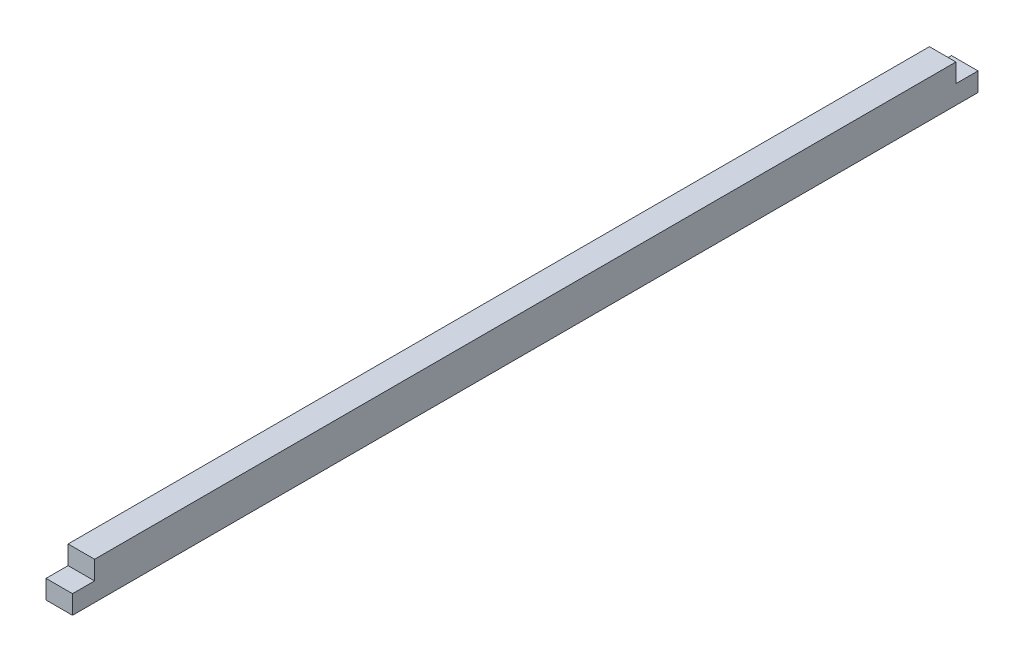
ISO-10303-21;
HEADER;
FILE_DESCRIPTION(('STEP AP214'),'2;1');
FILE_NAME('part.step','',(''),(''),'','','');
FILE_SCHEMA(('AUTOMOTIVE_DESIGN { 1 0 10303 214 1 1 1 1 }'));
ENDSEC;
DATA;
#1=APPLICATION_CONTEXT('core data for automotive mechanical design processes');
#2=APPLICATION_PROTOCOL_DEFINITION('international standard','automotive_design',2000,#1);
#3=PRODUCT_CONTEXT('',#1,'mechanical');
#4=PRODUCT('Part','Part','',(#3));
#5=PRODUCT_RELATED_PRODUCT_CATEGORY('part','',(#4));
#6=PRODUCT_DEFINITION_FORMATION('','',#4);
#7=PRODUCT_DEFINITION_CONTEXT('part definition',#1,'design');
#8=PRODUCT_DEFINITION('design','',#6,#7);
#9=PRODUCT_DEFINITION_SHAPE('','',#8);
#10=(LENGTH_UNIT() NAMED_UNIT(*) SI_UNIT(.MILLI.,.METRE.));
#11=(NAMED_UNIT(*) PLANE_ANGLE_UNIT() SI_UNIT($,.RADIAN.));
#12=(NAMED_UNIT(*) SI_UNIT($,.STERADIAN.) SOLID_ANGLE_UNIT());
#13=UNCERTAINTY_MEASURE_WITH_UNIT(LENGTH_MEASURE(1.E-05),#10,'distance_accuracy_value','');
#14=(GEOMETRIC_REPRESENTATION_CONTEXT(3) GLOBAL_UNCERTAINTY_ASSIGNED_CONTEXT((#13)) GLOBAL_UNIT_ASSIGNED_CONTEXT((#10,
#11,#12)) REPRESENTATION_CONTEXT('',''));
#15=CARTESIAN_POINT('',(0.,0.,0.));
#16=DIRECTION('',(0.,0.,1.));
#17=DIRECTION('',(1.,0.,0.));
#18=AXIS2_PLACEMENT_3D('',#15,#16,#17);
#19=CARTESIAN_POINT('',(12.,0.,0.));
#20=DIRECTION('',(0.,0.,-1.));
#21=DIRECTION('',(-1.,0.,0.));
#22=AXIS2_PLACEMENT_3D('',#19,#20,#21);
#23=PLANE('',#22);
#24=DIRECTION('',(0.,-1.,0.));
#25=VECTOR('',#24,1.);
#26=CARTESIAN_POINT('',(12.,0.,0.));
#27=LINE('',#26,#25);
#28=CARTESIAN_POINT('',(12.,8.5,0.));
#29=VERTEX_POINT('',#28);
#30=CARTESIAN_POINT('',(12.,0.,0.));
#31=VERTEX_POINT('',#30);
#32=EDGE_CURVE('E112',#29,#31,#27,.T.);
#33=ORIENTED_EDGE('',*,*,#32,.F.);
#34=DIRECTION('',(1.,0.,0.));
#35=VECTOR('',#34,1.);
#36=CARTESIAN_POINT('',(0.,8.5,0.));
#37=LINE('',#36,#35);
#38=CARTESIAN_POINT('',(0.,8.5,0.));
#39=VERTEX_POINT('',#38);
#40=EDGE_CURVE('E100',#39,#29,#37,.T.);
#41=ORIENTED_EDGE('',*,*,#40,.F.);
#42=DIRECTION('',(0.,-1.,0.));
#43=VECTOR('',#42,1.);
#44=CARTESIAN_POINT('',(0.,0.,0.));
#45=LINE('',#44,#43);
#46=CARTESIAN_POINT('',(0.,0.,0.));
#47=VERTEX_POINT('',#46);
#48=EDGE_CURVE('E110',#39,#47,#45,.T.);
#49=ORIENTED_EDGE('',*,*,#48,.T.);
#50=DIRECTION('',(-1.,0.,0.));
#51=VECTOR('',#50,1.);
#52=CARTESIAN_POINT('',(12.,0.,0.));
#53=LINE('',#52,#51);
#54=EDGE_CURVE('E11',#31,#47,#53,.T.);
#55=ORIENTED_EDGE('',*,*,#54,.F.);
#56=EDGE_LOOP('',(#33,#41,#49,#55));
#57=FACE_BOUND('',#56,.T.);
#58=ADVANCED_FACE('F33',(#57),#23,.F.);
#59=CARTESIAN_POINT('',(12.,0.,0.));
#60=DIRECTION('',(0.,1.,0.));
#61=DIRECTION('',(0.,0.,1.));
#62=AXIS2_PLACEMENT_3D('',#59,#60,#61);
#63=PLANE('',#62);
#64=DIRECTION('',(0.,0.,-1.));
#65=VECTOR('',#64,1.);
#66=CARTESIAN_POINT('',(0.,0.,0.));
#67=LINE('',#66,#65);
#68=CARTESIAN_POINT('',(0.,0.,-410.));
#69=VERTEX_POINT('',#68);
#70=EDGE_CURVE('E116',#47,#69,#67,.T.);
#71=ORIENTED_EDGE('',*,*,#70,.T.);
#72=DIRECTION('',(-1.,0.,0.));
#73=VECTOR('',#72,1.);
#74=CARTESIAN_POINT('',(12.,0.,-410.));
#75=LINE('',#74,#73);
#76=CARTESIAN_POINT('',(12.,0.,-410.));
#77=VERTEX_POINT('',#76);
#78=EDGE_CURVE('E40',#77,#69,#75,.T.);
#79=ORIENTED_EDGE('',*,*,#78,.F.);
#80=DIRECTION('',(0.,0.,-1.));
#81=VECTOR('',#80,1.);
#82=CARTESIAN_POINT('',(12.,0.,0.));
#83=LINE('',#82,#81);
#84=EDGE_CURVE('E142',#31,#77,#83,.T.);
#85=ORIENTED_EDGE('',*,*,#84,.F.);
#86=ORIENTED_EDGE('',*,*,#54,.T.);
#87=EDGE_LOOP('',(#71,#79,#85,#86));
#88=FACE_BOUND('',#87,.T.);
#89=ADVANCED_FACE('F177',(#88),#63,.F.);
#90=CARTESIAN_POINT('',(12.,0.,-410.));
#91=DIRECTION('',(0.,0.,1.));
#92=DIRECTION('',(1.,0.,0.));
#93=AXIS2_PLACEMENT_3D('',#90,#91,#92);
#94=PLANE('',#93);
#95=DIRECTION('',(0.,1.,0.));
#96=VECTOR('',#95,1.);
#97=CARTESIAN_POINT('',(0.,0.,-410.));
#98=LINE('',#97,#96);
#99=CARTESIAN_POINT('',(0.,8.50000000000005,-410.));
#100=VERTEX_POINT('',#99);
#101=EDGE_CURVE('E119',#69,#100,#98,.T.);
#102=ORIENTED_EDGE('',*,*,#101,.T.);
#103=DIRECTION('',(1.,0.,0.));
#104=VECTOR('',#103,1.);
#105=CARTESIAN_POINT('',(0.,8.50000000000005,-410.));
#106=LINE('',#105,#104);
#107=CARTESIAN_POINT('',(12.,8.50000000000005,-410.));
#108=VERTEX_POINT('',#107);
#109=EDGE_CURVE('E151',#100,#108,#106,.T.);
#110=ORIENTED_EDGE('',*,*,#109,.T.);
#111=DIRECTION('',(0.,1.,0.));
#112=VECTOR('',#111,1.);
#113=CARTESIAN_POINT('',(12.,0.,-410.));
#114=LINE('',#113,#112);
#115=EDGE_CURVE('E136',#77,#108,#114,.T.);
#116=ORIENTED_EDGE('',*,*,#115,.F.);
#117=ORIENTED_EDGE('',*,*,#78,.T.);
#118=EDGE_LOOP('',(#102,#110,#116,#117));
#119=FACE_BOUND('',#118,.T.);
#120=ADVANCED_FACE('F175',(#119),#94,.F.);
#121=CARTESIAN_POINT('',(12.,17.,0.));
#122=DIRECTION('',(0.,-1.,0.));
#123=DIRECTION('',(0.,0.,-1.));
#124=AXIS2_PLACEMENT_3D('',#121,#122,#123);
#125=PLANE('',#124);
#126=DIRECTION('',(0.,0.,1.));
#127=VECTOR('',#126,1.);
#128=CARTESIAN_POINT('',(0.,17.,0.));
#129=LINE('',#128,#127);
#130=CARTESIAN_POINT('',(0.,17.,-400.));
#131=VERTEX_POINT('',#130);
#132=CARTESIAN_POINT('',(0.,17.,-10.));
#133=VERTEX_POINT('',#132);
#134=EDGE_CURVE('E129',#131,#133,#129,.T.);
#135=ORIENTED_EDGE('',*,*,#134,.T.);
#136=DIRECTION('',(1.,0.,0.));
#137=VECTOR('',#136,1.);
#138=CARTESIAN_POINT('',(0.,17.,-10.));
#139=LINE('',#138,#137);
#140=CARTESIAN_POINT('',(12.,17.,-10.));
#141=VERTEX_POINT('',#140);
#142=EDGE_CURVE('E117',#133,#141,#139,.T.);
#143=ORIENTED_EDGE('',*,*,#142,.T.);
#144=DIRECTION('',(0.,0.,1.));
#145=VECTOR('',#144,1.);
#146=CARTESIAN_POINT('',(12.,17.,0.));
#147=LINE('',#146,#145);
#148=CARTESIAN_POINT('',(12.,17.,-400.));
#149=VERTEX_POINT('',#148);
#150=EDGE_CURVE('E124',#149,#141,#147,.T.);
#151=ORIENTED_EDGE('',*,*,#150,.F.);
#152=DIRECTION('',(1.,0.,0.));
#153=VECTOR('',#152,1.);
#154=CARTESIAN_POINT('',(0.,17.,-400.));
#155=LINE('',#154,#153);
#156=EDGE_CURVE('E147',#131,#149,#155,.T.);
#157=ORIENTED_EDGE('',*,*,#156,.F.);
#158=EDGE_LOOP('',(#135,#143,#151,#157));
#159=FACE_BOUND('',#158,.T.);
#160=ADVANCED_FACE('F170',(#159),#125,.F.);
#161=CARTESIAN_POINT('',(12.,0.,0.));
#162=DIRECTION('',(-1.,0.,0.));
#163=DIRECTION('',(0.,0.,1.));
#164=AXIS2_PLACEMENT_3D('',#161,#162,#163);
#165=PLANE('',#164);
#166=ORIENTED_EDGE('',*,*,#150,.T.);
#167=DIRECTION('',(0.,1.,0.));
#168=VECTOR('',#167,1.);
#169=CARTESIAN_POINT('',(12.,17.,-10.));
#170=LINE('',#169,#168);
#171=CARTESIAN_POINT('',(12.,8.5,-10.));
#172=VERTEX_POINT('',#171);
#173=EDGE_CURVE('E105',#172,#141,#170,.T.);
#174=ORIENTED_EDGE('',*,*,#173,.F.);
#175=DIRECTION('',(0.,0.,-1.));
#176=VECTOR('',#175,1.);
#177=CARTESIAN_POINT('',(12.,8.5,0.));
#178=LINE('',#177,#176);
#179=EDGE_CURVE('E154',#29,#172,#178,.T.);
#180=ORIENTED_EDGE('',*,*,#179,.F.);
#181=ORIENTED_EDGE('',*,*,#32,.T.);
#182=ORIENTED_EDGE('',*,*,#84,.T.);
#183=ORIENTED_EDGE('',*,*,#115,.T.);
#184=DIRECTION('',(0.,0.,-1.));
#185=VECTOR('',#184,1.);
#186=CARTESIAN_POINT('',(12.,8.50000000000005,-410.));
#187=LINE('',#186,#185);
#188=CARTESIAN_POINT('',(12.,8.50000000000005,-400.));
#189=VERTEX_POINT('',#188);
#190=EDGE_CURVE('E155',#189,#108,#187,.T.);
#191=ORIENTED_EDGE('',*,*,#190,.F.);
#192=DIRECTION('',(0.,-1.,0.));
#193=VECTOR('',#192,1.);
#194=CARTESIAN_POINT('',(12.,17.,-400.));
#195=LINE('',#194,#193);
#196=EDGE_CURVE('E158',#149,#189,#195,.T.);
#197=ORIENTED_EDGE('',*,*,#196,.F.);
#198=EDGE_LOOP('',(#166,#174,#180,#181,#182,#183,#191,#197));
#199=FACE_BOUND('',#198,.T.);
#200=ADVANCED_FACE('F173',(#199),#165,.F.);
#201=CARTESIAN_POINT('',(0.,0.,0.));
#202=DIRECTION('',(-1.,0.,0.));
#203=DIRECTION('',(0.,0.,1.));
#204=AXIS2_PLACEMENT_3D('',#201,#202,#203);
#205=PLANE('',#204);
#206=DIRECTION('',(0.,1.,0.));
#207=VECTOR('',#206,1.);
#208=CARTESIAN_POINT('',(0.,17.,-10.));
#209=LINE('',#208,#207);
#210=CARTESIAN_POINT('',(0.,8.5,-10.));
#211=VERTEX_POINT('',#210);
#212=EDGE_CURVE('E47',#211,#133,#209,.T.);
#213=ORIENTED_EDGE('',*,*,#212,.T.);
#214=ORIENTED_EDGE('',*,*,#134,.F.);
#215=DIRECTION('',(0.,-1.,0.));
#216=VECTOR('',#215,1.);
#217=CARTESIAN_POINT('',(0.,17.,-400.));
#218=LINE('',#217,#216);
#219=CARTESIAN_POINT('',(0.,8.50000000000005,-400.));
#220=VERTEX_POINT('',#219);
#221=EDGE_CURVE('E157',#131,#220,#218,.T.);
#222=ORIENTED_EDGE('',*,*,#221,.T.);
#223=DIRECTION('',(0.,0.,-1.));
#224=VECTOR('',#223,1.);
#225=CARTESIAN_POINT('',(0.,8.50000000000005,-410.));
#226=LINE('',#225,#224);
#227=EDGE_CURVE('E55',#220,#100,#226,.T.);
#228=ORIENTED_EDGE('',*,*,#227,.T.);
#229=ORIENTED_EDGE('',*,*,#101,.F.);
#230=ORIENTED_EDGE('',*,*,#70,.F.);
#231=ORIENTED_EDGE('',*,*,#48,.F.);
#232=DIRECTION('',(0.,0.,-1.));
#233=VECTOR('',#232,1.);
#234=CARTESIAN_POINT('',(0.,8.5,0.));
#235=LINE('',#234,#233);
#236=EDGE_CURVE('E96',#39,#211,#235,.T.);
#237=ORIENTED_EDGE('',*,*,#236,.T.);
#238=EDGE_LOOP('',(#213,#214,#222,#228,#229,#230,#231,#237));
#239=FACE_BOUND('',#238,.T.);
#240=ADVANCED_FACE('F114',(#239),#205,.T.);
#241=CARTESIAN_POINT('',(0.,8.50000000000005,-410.));
#242=DIRECTION('',(0.,-1.,0.));
#243=DIRECTION('',(0.,0.,-1.));
#244=AXIS2_PLACEMENT_3D('',#241,#242,#243);
#245=PLANE('',#244);
#246=ORIENTED_EDGE('',*,*,#190,.T.);
#247=ORIENTED_EDGE('',*,*,#109,.F.);
#248=ORIENTED_EDGE('',*,*,#227,.F.);
#249=DIRECTION('',(1.,0.,0.));
#250=VECTOR('',#249,1.);
#251=CARTESIAN_POINT('',(0.,8.50000000000005,-400.));
#252=LINE('',#251,#250);
#253=EDGE_CURVE('E149',#220,#189,#252,.T.);
#254=ORIENTED_EDGE('',*,*,#253,.T.);
#255=EDGE_LOOP('',(#246,#247,#248,#254));
#256=FACE_BOUND('',#255,.T.);
#257=ADVANCED_FACE('F174',(#256),#245,.F.);
#258=CARTESIAN_POINT('',(0.,17.,-400.));
#259=DIRECTION('',(0.,0.,1.));
#260=DIRECTION('',(1.,0.,0.));
#261=AXIS2_PLACEMENT_3D('',#258,#259,#260);
#262=PLANE('',#261);
#263=ORIENTED_EDGE('',*,*,#196,.T.);
#264=ORIENTED_EDGE('',*,*,#253,.F.);
#265=ORIENTED_EDGE('',*,*,#221,.F.);
#266=ORIENTED_EDGE('',*,*,#156,.T.);
#267=EDGE_LOOP('',(#263,#264,#265,#266));
#268=FACE_BOUND('',#267,.T.);
#269=ADVANCED_FACE('F172',(#268),#262,.F.);
#270=CARTESIAN_POINT('',(0.,17.,-10.));
#271=DIRECTION('',(0.,0.,-1.));
#272=DIRECTION('',(0.,1.,0.));
#273=AXIS2_PLACEMENT_3D('',#270,#271,#272);
#274=PLANE('',#273);
#275=ORIENTED_EDGE('',*,*,#173,.T.);
#276=ORIENTED_EDGE('',*,*,#142,.F.);
#277=ORIENTED_EDGE('',*,*,#212,.F.);
#278=DIRECTION('',(1.,0.,0.));
#279=VECTOR('',#278,1.);
#280=CARTESIAN_POINT('',(0.,8.5,-10.));
#281=LINE('',#280,#279);
#282=EDGE_CURVE('E102',#211,#172,#281,.T.);
#283=ORIENTED_EDGE('',*,*,#282,.T.);
#284=EDGE_LOOP('',(#275,#276,#277,#283));
#285=FACE_BOUND('',#284,.T.);
#286=ADVANCED_FACE('F234',(#285),#274,.F.);
#287=CARTESIAN_POINT('',(0.,8.5,0.));
#288=DIRECTION('',(0.,-1.,0.));
#289=DIRECTION('',(0.,0.,-1.));
#290=AXIS2_PLACEMENT_3D('',#287,#288,#289);
#291=PLANE('',#290);
#292=ORIENTED_EDGE('',*,*,#179,.T.);
#293=ORIENTED_EDGE('',*,*,#282,.F.);
#294=ORIENTED_EDGE('',*,*,#236,.F.);
#295=ORIENTED_EDGE('',*,*,#40,.T.);
#296=EDGE_LOOP('',(#292,#293,#294,#295));
#297=FACE_BOUND('',#296,.T.);
#298=ADVANCED_FACE('F99',(#297),#291,.F.);
#299=CLOSED_SHELL('',(#58,#89,#120,#160,#200,#240,#257,#269,#286,#298));
#300=MANIFOLD_SOLID_BREP('B2',#299);
#301=ADVANCED_BREP_SHAPE_REPRESENTATION('',(#18,#300),#14);
#302=SHAPE_DEFINITION_REPRESENTATION(#9,#301);
ENDSEC;
END-ISO-10303-21;
